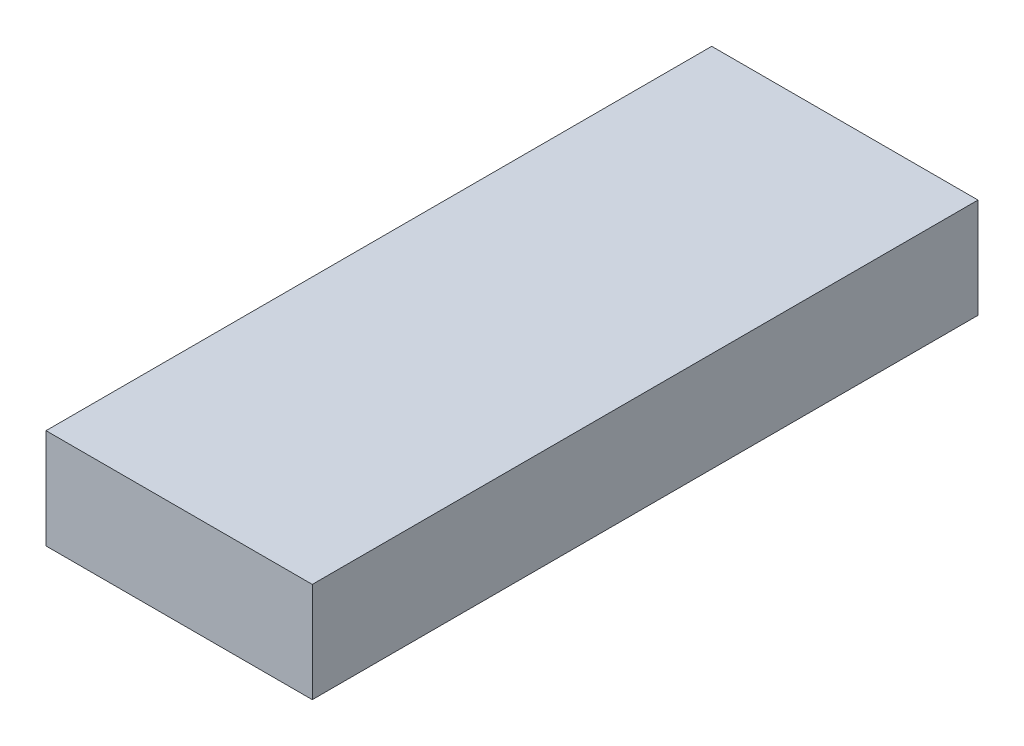
ISO-10303-21;
HEADER;
FILE_DESCRIPTION(('STEP AP214'),'2;1');
FILE_NAME('part.step','',(''),(''),'','','');
FILE_SCHEMA(('AUTOMOTIVE_DESIGN { 1 0 10303 214 1 1 1 1 }'));
ENDSEC;
DATA;
#1=APPLICATION_CONTEXT('core data for automotive mechanical design processes');
#2=APPLICATION_PROTOCOL_DEFINITION('international standard','automotive_design',2000,#1);
#3=PRODUCT_CONTEXT('',#1,'mechanical');
#4=PRODUCT('Part','Part','',(#3));
#5=PRODUCT_RELATED_PRODUCT_CATEGORY('part','',(#4));
#6=PRODUCT_DEFINITION_FORMATION('','',#4);
#7=PRODUCT_DEFINITION_CONTEXT('part definition',#1,'design');
#8=PRODUCT_DEFINITION('design','',#6,#7);
#9=PRODUCT_DEFINITION_SHAPE('','',#8);
#10=(LENGTH_UNIT() NAMED_UNIT(*) SI_UNIT(.MILLI.,.METRE.));
#11=(NAMED_UNIT(*) PLANE_ANGLE_UNIT() SI_UNIT($,.RADIAN.));
#12=(NAMED_UNIT(*) SI_UNIT($,.STERADIAN.) SOLID_ANGLE_UNIT());
#13=UNCERTAINTY_MEASURE_WITH_UNIT(LENGTH_MEASURE(1.E-05),#10,'distance_accuracy_value','');
#14=(GEOMETRIC_REPRESENTATION_CONTEXT(3) GLOBAL_UNCERTAINTY_ASSIGNED_CONTEXT((#13)) GLOBAL_UNIT_ASSIGNED_CONTEXT((#10,
#11,#12)) REPRESENTATION_CONTEXT('',''));
#15=CARTESIAN_POINT('',(0.,0.,0.));
#16=DIRECTION('',(0.,0.,1.));
#17=DIRECTION('',(1.,0.,0.));
#18=AXIS2_PLACEMENT_3D('',#15,#16,#17);
#19=CARTESIAN_POINT('',(0.31999936,0.11999976,1.59999934));
#20=DIRECTION('',(0.,0.,-1.));
#21=DIRECTION('',(0.,-1.,0.));
#22=AXIS2_PLACEMENT_3D('',#19,#20,#21);
#23=PLANE('',#22);
#24=DIRECTION('',(-1.,0.,0.));
#25=VECTOR('',#24,1.);
#26=CARTESIAN_POINT('',(0.31999936,0.11999976,1.59999934));
#27=LINE('',#26,#25);
#28=CARTESIAN_POINT('',(0.31999936,0.11999976,1.59999934));
#29=VERTEX_POINT('',#28);
#30=CARTESIAN_POINT('',(-0.31999936,0.11999976,1.59999934));
#31=VERTEX_POINT('',#30);
#32=EDGE_CURVE('E20',#29,#31,#27,.T.);
#33=ORIENTED_EDGE('',*,*,#32,.T.);
#34=DIRECTION('',(0.,-1.,0.));
#35=VECTOR('',#34,1.);
#36=CARTESIAN_POINT('',(-0.31999936,0.11999976,1.59999934));
#37=LINE('',#36,#35);
#38=CARTESIAN_POINT('',(-0.31999936,-0.11999976,1.59999934));
#39=VERTEX_POINT('',#38);
#40=EDGE_CURVE('E75',#31,#39,#37,.T.);
#41=ORIENTED_EDGE('',*,*,#40,.T.);
#42=DIRECTION('',(1.,0.,0.));
#43=VECTOR('',#42,1.);
#44=CARTESIAN_POINT('',(-0.31999936,-0.11999976,1.59999934));
#45=LINE('',#44,#43);
#46=CARTESIAN_POINT('',(0.31999936,-0.11999976,1.59999934));
#47=VERTEX_POINT('',#46);
#48=EDGE_CURVE('E90',#39,#47,#45,.T.);
#49=ORIENTED_EDGE('',*,*,#48,.T.);
#50=DIRECTION('',(0.,1.,0.));
#51=VECTOR('',#50,1.);
#52=CARTESIAN_POINT('',(0.31999936,-0.11999976,1.59999934));
#53=LINE('',#52,#51);
#54=EDGE_CURVE('E11',#47,#29,#53,.T.);
#55=ORIENTED_EDGE('',*,*,#54,.T.);
#56=EDGE_LOOP('',(#33,#41,#49,#55));
#57=FACE_BOUND('',#56,.T.);
#58=ADVANCED_FACE('F16',(#57),#23,.F.);
#59=CARTESIAN_POINT('',(0.31999936,0.11999976,0.));
#60=DIRECTION('',(0.,0.,-1.));
#61=DIRECTION('',(0.,-1.,0.));
#62=AXIS2_PLACEMENT_3D('',#59,#60,#61);
#63=PLANE('',#62);
#64=DIRECTION('',(0.,1.,0.));
#65=VECTOR('',#64,1.);
#66=CARTESIAN_POINT('',(0.31999936,-0.11999976,0.));
#67=LINE('',#66,#65);
#68=CARTESIAN_POINT('',(0.31999936,-0.11999976,0.));
#69=VERTEX_POINT('',#68);
#70=CARTESIAN_POINT('',(0.31999936,0.11999976,0.));
#71=VERTEX_POINT('',#70);
#72=EDGE_CURVE('E27',#69,#71,#67,.T.);
#73=ORIENTED_EDGE('',*,*,#72,.F.);
#74=DIRECTION('',(1.,0.,0.));
#75=VECTOR('',#74,1.);
#76=CARTESIAN_POINT('',(-0.31999936,-0.11999976,0.));
#77=LINE('',#76,#75);
#78=CARTESIAN_POINT('',(-0.31999936,-0.11999976,0.));
#79=VERTEX_POINT('',#78);
#80=EDGE_CURVE('E59',#79,#69,#77,.T.);
#81=ORIENTED_EDGE('',*,*,#80,.F.);
#82=DIRECTION('',(0.,-1.,0.));
#83=VECTOR('',#82,1.);
#84=CARTESIAN_POINT('',(-0.31999936,0.11999976,0.));
#85=LINE('',#84,#83);
#86=CARTESIAN_POINT('',(-0.31999936,0.11999976,0.));
#87=VERTEX_POINT('',#86);
#88=EDGE_CURVE('E79',#87,#79,#85,.T.);
#89=ORIENTED_EDGE('',*,*,#88,.F.);
#90=DIRECTION('',(-1.,0.,0.));
#91=VECTOR('',#90,1.);
#92=CARTESIAN_POINT('',(0.31999936,0.11999976,0.));
#93=LINE('',#92,#91);
#94=EDGE_CURVE('E94',#71,#87,#93,.T.);
#95=ORIENTED_EDGE('',*,*,#94,.F.);
#96=EDGE_LOOP('',(#73,#81,#89,#95));
#97=FACE_BOUND('',#96,.T.);
#98=ADVANCED_FACE('F97',(#97),#63,.T.);
#99=CARTESIAN_POINT('',(0.31999936,-0.11999976,0.));
#100=DIRECTION('',(-1.,0.,0.));
#101=DIRECTION('',(0.,0.,1.));
#102=AXIS2_PLACEMENT_3D('',#99,#100,#101);
#103=PLANE('',#102);
#104=ORIENTED_EDGE('',*,*,#72,.T.);
#105=DIRECTION('',(0.,0.,1.));
#106=VECTOR('',#105,1.);
#107=CARTESIAN_POINT('',(0.31999936,0.11999976,0.));
#108=LINE('',#107,#106);
#109=EDGE_CURVE('E85',#71,#29,#108,.T.);
#110=ORIENTED_EDGE('',*,*,#109,.T.);
#111=ORIENTED_EDGE('',*,*,#54,.F.);
#112=DIRECTION('',(0.,0.,1.));
#113=VECTOR('',#112,1.);
#114=CARTESIAN_POINT('',(0.31999936,-0.11999976,0.));
#115=LINE('',#114,#113);
#116=EDGE_CURVE('E88',#69,#47,#115,.T.);
#117=ORIENTED_EDGE('',*,*,#116,.F.);
#118=EDGE_LOOP('',(#104,#110,#111,#117));
#119=FACE_BOUND('',#118,.T.);
#120=ADVANCED_FACE('F84',(#119),#103,.F.);
#121=CARTESIAN_POINT('',(-0.31999936,-0.11999976,0.));
#122=DIRECTION('',(0.,1.,0.));
#123=DIRECTION('',(1.,0.,0.));
#124=AXIS2_PLACEMENT_3D('',#121,#122,#123);
#125=PLANE('',#124);
#126=ORIENTED_EDGE('',*,*,#80,.T.);
#127=ORIENTED_EDGE('',*,*,#116,.T.);
#128=ORIENTED_EDGE('',*,*,#48,.F.);
#129=DIRECTION('',(0.,0.,1.));
#130=VECTOR('',#129,1.);
#131=CARTESIAN_POINT('',(-0.31999936,-0.11999976,0.));
#132=LINE('',#131,#130);
#133=EDGE_CURVE('E112',#79,#39,#132,.T.);
#134=ORIENTED_EDGE('',*,*,#133,.F.);
#135=EDGE_LOOP('',(#126,#127,#128,#134));
#136=FACE_BOUND('',#135,.T.);
#137=ADVANCED_FACE('F122',(#136),#125,.F.);
#138=CARTESIAN_POINT('',(-0.31999936,0.11999976,0.));
#139=DIRECTION('',(1.,0.,0.));
#140=DIRECTION('',(0.,1.,0.));
#141=AXIS2_PLACEMENT_3D('',#138,#139,#140);
#142=PLANE('',#141);
#143=ORIENTED_EDGE('',*,*,#88,.T.);
#144=ORIENTED_EDGE('',*,*,#133,.T.);
#145=ORIENTED_EDGE('',*,*,#40,.F.);
#146=DIRECTION('',(0.,0.,1.));
#147=VECTOR('',#146,1.);
#148=CARTESIAN_POINT('',(-0.31999936,0.11999976,0.));
#149=LINE('',#148,#147);
#150=EDGE_CURVE('E99',#87,#31,#149,.T.);
#151=ORIENTED_EDGE('',*,*,#150,.F.);
#152=EDGE_LOOP('',(#143,#144,#145,#151));
#153=FACE_BOUND('',#152,.T.);
#154=ADVANCED_FACE('F120',(#153),#142,.F.);
#155=CARTESIAN_POINT('',(0.31999936,0.11999976,0.));
#156=DIRECTION('',(0.,-1.,0.));
#157=DIRECTION('',(0.,0.,-1.));
#158=AXIS2_PLACEMENT_3D('',#155,#156,#157);
#159=PLANE('',#158);
#160=ORIENTED_EDGE('',*,*,#94,.T.);
#161=ORIENTED_EDGE('',*,*,#150,.T.);
#162=ORIENTED_EDGE('',*,*,#32,.F.);
#163=ORIENTED_EDGE('',*,*,#109,.F.);
#164=EDGE_LOOP('',(#160,#161,#162,#163));
#165=FACE_BOUND('',#164,.T.);
#166=ADVANCED_FACE('F18',(#165),#159,.F.);
#167=CLOSED_SHELL('',(#58,#98,#120,#137,#154,#166));
#168=MANIFOLD_SOLID_BREP('B1',#167);
#169=ADVANCED_BREP_SHAPE_REPRESENTATION('',(#18,#168),#14);
#170=SHAPE_DEFINITION_REPRESENTATION(#9,#169);
ENDSEC;
END-ISO-10303-21;
